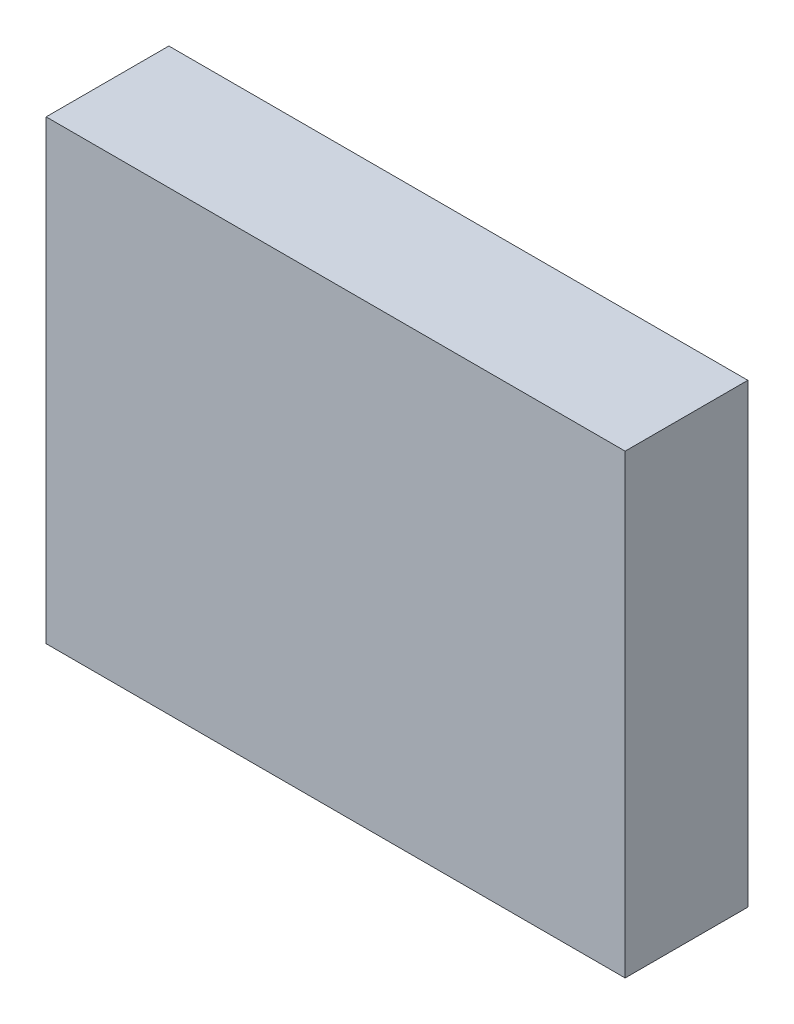
ISO-10303-21;
HEADER;
FILE_DESCRIPTION(('STEP AP214'),'2;1');
FILE_NAME('part.step','',(''),(''),'','','');
FILE_SCHEMA(('AUTOMOTIVE_DESIGN { 1 0 10303 214 1 1 1 1 }'));
ENDSEC;
DATA;
#1=APPLICATION_CONTEXT('core data for automotive mechanical design processes');
#2=APPLICATION_PROTOCOL_DEFINITION('international standard','automotive_design',2000,#1);
#3=PRODUCT_CONTEXT('',#1,'mechanical');
#4=PRODUCT('Part','Part','',(#3));
#5=PRODUCT_RELATED_PRODUCT_CATEGORY('part','',(#4));
#6=PRODUCT_DEFINITION_FORMATION('','',#4);
#7=PRODUCT_DEFINITION_CONTEXT('part definition',#1,'design');
#8=PRODUCT_DEFINITION('design','',#6,#7);
#9=PRODUCT_DEFINITION_SHAPE('','',#8);
#10=(LENGTH_UNIT() NAMED_UNIT(*) SI_UNIT(.MILLI.,.METRE.));
#11=(NAMED_UNIT(*) PLANE_ANGLE_UNIT() SI_UNIT($,.RADIAN.));
#12=(NAMED_UNIT(*) SI_UNIT($,.STERADIAN.) SOLID_ANGLE_UNIT());
#13=UNCERTAINTY_MEASURE_WITH_UNIT(LENGTH_MEASURE(1.E-05),#10,'distance_accuracy_value','');
#14=(GEOMETRIC_REPRESENTATION_CONTEXT(3) GLOBAL_UNCERTAINTY_ASSIGNED_CONTEXT((#13)) GLOBAL_UNIT_ASSIGNED_CONTEXT((#10,
#11,#12)) REPRESENTATION_CONTEXT('',''));
#15=CARTESIAN_POINT('',(0.,0.,0.));
#16=DIRECTION('',(0.,0.,1.));
#17=DIRECTION('',(1.,0.,0.));
#18=AXIS2_PLACEMENT_3D('',#15,#16,#17);
#19=CARTESIAN_POINT('',(-1.67500046,-1.3199999,0.71000112));
#20=DIRECTION('',(0.,0.,-1.));
#21=DIRECTION('',(-1.,0.,0.));
#22=AXIS2_PLACEMENT_3D('',#19,#20,#21);
#23=PLANE('',#22);
#24=DIRECTION('',(0.,1.,0.));
#25=VECTOR('',#24,1.);
#26=CARTESIAN_POINT('',(1.67500046,-1.3199999,0.71000112));
#27=LINE('',#26,#25);
#28=CARTESIAN_POINT('',(1.67500046,-1.3199999,0.71000112));
#29=VERTEX_POINT('',#28);
#30=CARTESIAN_POINT('',(1.67500046,1.3199999,0.71000112));
#31=VERTEX_POINT('',#30);
#32=EDGE_CURVE('E54',#29,#31,#27,.T.);
#33=ORIENTED_EDGE('',*,*,#32,.T.);
#34=DIRECTION('',(1.,0.,0.));
#35=VECTOR('',#34,1.);
#36=CARTESIAN_POINT('',(1.67500046,1.3199999,0.71000112));
#37=LINE('',#36,#35);
#38=CARTESIAN_POINT('',(-1.67500046,1.3199999,0.71000112));
#39=VERTEX_POINT('',#38);
#40=EDGE_CURVE('E56',#31,#39,#37,.F.);
#41=ORIENTED_EDGE('',*,*,#40,.T.);
#42=DIRECTION('',(0.,1.,0.));
#43=VECTOR('',#42,1.);
#44=CARTESIAN_POINT('',(-1.67500046,1.3199999,0.71000112));
#45=LINE('',#44,#43);
#46=CARTESIAN_POINT('',(-1.67500046,-1.3199999,0.71000112));
#47=VERTEX_POINT('',#46);
#48=EDGE_CURVE('E19',#39,#47,#45,.F.);
#49=ORIENTED_EDGE('',*,*,#48,.T.);
#50=DIRECTION('',(1.,0.,0.));
#51=VECTOR('',#50,1.);
#52=CARTESIAN_POINT('',(-1.67500046,-1.3199999,0.71000112));
#53=LINE('',#52,#51);
#54=EDGE_CURVE('E79',#47,#29,#53,.T.);
#55=ORIENTED_EDGE('',*,*,#54,.T.);
#56=EDGE_LOOP('',(#33,#41,#49,#55));
#57=FACE_BOUND('',#56,.T.);
#58=ADVANCED_FACE('F16',(#57),#23,.F.);
#59=CARTESIAN_POINT('',(-1.67500046,1.3199999,0.));
#60=DIRECTION('',(1.,0.,0.));
#61=DIRECTION('',(0.,0.,-1.));
#62=AXIS2_PLACEMENT_3D('',#59,#60,#61);
#63=PLANE('',#62);
#64=DIRECTION('',(0.,0.,1.));
#65=VECTOR('',#64,1.);
#66=CARTESIAN_POINT('',(-1.67500046,-1.3199999,0.));
#67=LINE('',#66,#65);
#68=CARTESIAN_POINT('',(-1.67500046,-1.3199999,0.));
#69=VERTEX_POINT('',#68);
#70=EDGE_CURVE('E67',#69,#47,#67,.T.);
#71=ORIENTED_EDGE('',*,*,#70,.T.);
#72=ORIENTED_EDGE('',*,*,#48,.F.);
#73=DIRECTION('',(0.,0.,-1.));
#74=VECTOR('',#73,1.);
#75=CARTESIAN_POINT('',(-1.67500046,1.3199999,0.));
#76=LINE('',#75,#74);
#77=CARTESIAN_POINT('',(-1.67500046,1.3199999,0.));
#78=VERTEX_POINT('',#77);
#79=EDGE_CURVE('E62',#39,#78,#76,.T.);
#80=ORIENTED_EDGE('',*,*,#79,.T.);
#81=DIRECTION('',(0.,1.,0.));
#82=VECTOR('',#81,1.);
#83=CARTESIAN_POINT('',(-1.67500046,-1.3199999,0.));
#84=LINE('',#83,#82);
#85=EDGE_CURVE('E82',#69,#78,#84,.T.);
#86=ORIENTED_EDGE('',*,*,#85,.F.);
#87=EDGE_LOOP('',(#71,#72,#80,#86));
#88=FACE_BOUND('',#87,.T.);
#89=ADVANCED_FACE('F64',(#88),#63,.F.);
#90=CARTESIAN_POINT('',(1.67500046,1.3199999,0.));
#91=DIRECTION('',(0.,-1.,0.));
#92=DIRECTION('',(0.,0.,-1.));
#93=AXIS2_PLACEMENT_3D('',#90,#91,#92);
#94=PLANE('',#93);
#95=ORIENTED_EDGE('',*,*,#79,.F.);
#96=ORIENTED_EDGE('',*,*,#40,.F.);
#97=DIRECTION('',(0.,0.,1.));
#98=VECTOR('',#97,1.);
#99=CARTESIAN_POINT('',(1.67500046,1.3199999,0.));
#100=LINE('',#99,#98);
#101=CARTESIAN_POINT('',(1.67500046,1.3199999,0.));
#102=VERTEX_POINT('',#101);
#103=EDGE_CURVE('E74',#31,#102,#100,.F.);
#104=ORIENTED_EDGE('',*,*,#103,.T.);
#105=DIRECTION('',(-1.,0.,0.));
#106=VECTOR('',#105,1.);
#107=CARTESIAN_POINT('',(-1.67500046,1.3199999,0.));
#108=LINE('',#107,#106);
#109=EDGE_CURVE('E71',#78,#102,#108,.F.);
#110=ORIENTED_EDGE('',*,*,#109,.F.);
#111=EDGE_LOOP('',(#95,#96,#104,#110));
#112=FACE_BOUND('',#111,.T.);
#113=ADVANCED_FACE('F69',(#112),#94,.F.);
#114=CARTESIAN_POINT('',(1.67500046,-1.3199999,0.));
#115=DIRECTION('',(-1.,0.,0.));
#116=DIRECTION('',(0.,0.,1.));
#117=AXIS2_PLACEMENT_3D('',#114,#115,#116);
#118=PLANE('',#117);
#119=ORIENTED_EDGE('',*,*,#103,.F.);
#120=ORIENTED_EDGE('',*,*,#32,.F.);
#121=DIRECTION('',(0.,0.,1.));
#122=VECTOR('',#121,1.);
#123=CARTESIAN_POINT('',(1.67500046,-1.3199999,0.));
#124=LINE('',#123,#122);
#125=CARTESIAN_POINT('',(1.67500046,-1.3199999,0.));
#126=VERTEX_POINT('',#125);
#127=EDGE_CURVE('E34',#29,#126,#124,.F.);
#128=ORIENTED_EDGE('',*,*,#127,.T.);
#129=DIRECTION('',(0.,1.,0.));
#130=VECTOR('',#129,1.);
#131=CARTESIAN_POINT('',(1.67500046,-1.3199999,0.));
#132=LINE('',#131,#130);
#133=EDGE_CURVE('E25',#102,#126,#132,.F.);
#134=ORIENTED_EDGE('',*,*,#133,.F.);
#135=EDGE_LOOP('',(#119,#120,#128,#134));
#136=FACE_BOUND('',#135,.T.);
#137=ADVANCED_FACE('F88',(#136),#118,.F.);
#138=CARTESIAN_POINT('',(-1.67500046,-1.3199999,0.));
#139=DIRECTION('',(0.,1.,0.));
#140=DIRECTION('',(0.,0.,1.));
#141=AXIS2_PLACEMENT_3D('',#138,#139,#140);
#142=PLANE('',#141);
#143=ORIENTED_EDGE('',*,*,#127,.F.);
#144=ORIENTED_EDGE('',*,*,#54,.F.);
#145=ORIENTED_EDGE('',*,*,#70,.F.);
#146=DIRECTION('',(-1.,0.,0.));
#147=VECTOR('',#146,1.);
#148=CARTESIAN_POINT('',(-1.67500046,-1.3199999,0.));
#149=LINE('',#148,#147);
#150=EDGE_CURVE('E11',#126,#69,#149,.T.);
#151=ORIENTED_EDGE('',*,*,#150,.F.);
#152=EDGE_LOOP('',(#143,#144,#145,#151));
#153=FACE_BOUND('',#152,.T.);
#154=ADVANCED_FACE('F90',(#153),#142,.F.);
#155=CARTESIAN_POINT('',(-1.67500046,-1.3199999,0.));
#156=DIRECTION('',(0.,0.,-1.));
#157=DIRECTION('',(-1.,0.,0.));
#158=AXIS2_PLACEMENT_3D('',#155,#156,#157);
#159=PLANE('',#158);
#160=ORIENTED_EDGE('',*,*,#133,.T.);
#161=ORIENTED_EDGE('',*,*,#150,.T.);
#162=ORIENTED_EDGE('',*,*,#85,.T.);
#163=ORIENTED_EDGE('',*,*,#109,.T.);
#164=EDGE_LOOP('',(#160,#161,#162,#163));
#165=FACE_BOUND('',#164,.T.);
#166=ADVANCED_FACE('F87',(#165),#159,.T.);
#167=CLOSED_SHELL('',(#58,#89,#113,#137,#154,#166));
#168=MANIFOLD_SOLID_BREP('B1',#167);
#169=ADVANCED_BREP_SHAPE_REPRESENTATION('',(#18,#168),#14);
#170=SHAPE_DEFINITION_REPRESENTATION(#9,#169);
ENDSEC;
END-ISO-10303-21;
